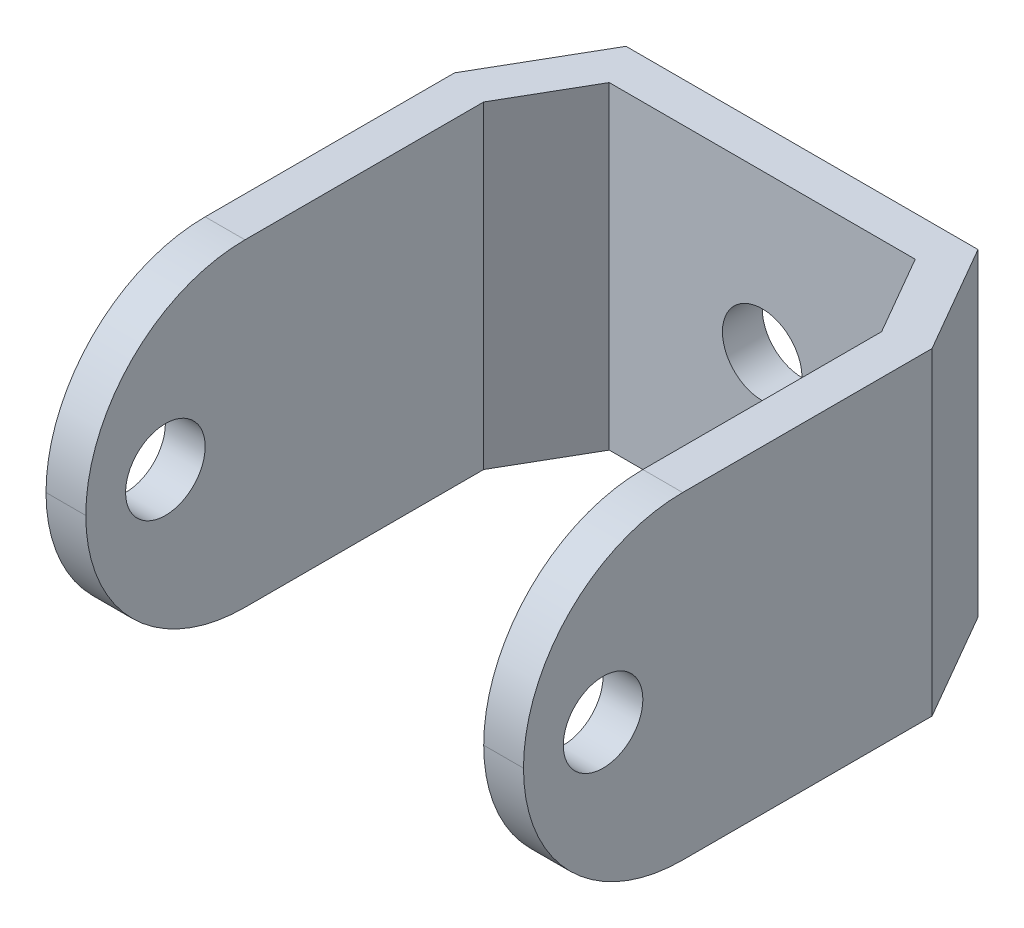
ISO-10303-21;
HEADER;
FILE_DESCRIPTION(('STEP AP214'),'2;1');
FILE_NAME('part.step','',(''),(''),'','','');
FILE_SCHEMA(('AUTOMOTIVE_DESIGN { 1 0 10303 214 1 1 1 1 }'));
ENDSEC;
DATA;
#1=APPLICATION_CONTEXT('core data for automotive mechanical design processes');
#2=APPLICATION_PROTOCOL_DEFINITION('international standard','automotive_design',2000,#1);
#3=PRODUCT_CONTEXT('',#1,'mechanical');
#4=PRODUCT('Part','Part','',(#3));
#5=PRODUCT_RELATED_PRODUCT_CATEGORY('part','',(#4));
#6=PRODUCT_DEFINITION_FORMATION('','',#4);
#7=PRODUCT_DEFINITION_CONTEXT('part definition',#1,'design');
#8=PRODUCT_DEFINITION('design','',#6,#7);
#9=PRODUCT_DEFINITION_SHAPE('','',#8);
#10=(LENGTH_UNIT() NAMED_UNIT(*) SI_UNIT(.MILLI.,.METRE.));
#11=(NAMED_UNIT(*) PLANE_ANGLE_UNIT() SI_UNIT($,.RADIAN.));
#12=(NAMED_UNIT(*) SI_UNIT($,.STERADIAN.) SOLID_ANGLE_UNIT());
#13=UNCERTAINTY_MEASURE_WITH_UNIT(LENGTH_MEASURE(1.E-05),#10,'distance_accuracy_value','');
#14=(GEOMETRIC_REPRESENTATION_CONTEXT(3) GLOBAL_UNCERTAINTY_ASSIGNED_CONTEXT((#13)) GLOBAL_UNIT_ASSIGNED_CONTEXT((#10,
#11,#12)) REPRESENTATION_CONTEXT('',''));
#15=CARTESIAN_POINT('',(0.,0.,0.));
#16=DIRECTION('',(0.,0.,1.));
#17=DIRECTION('',(1.,0.,0.));
#18=AXIS2_PLACEMENT_3D('',#15,#16,#17);
#19=CARTESIAN_POINT('',(-30.,40.,-51.3397459621556));
#20=DIRECTION('',(0.866025403784438,0.,0.500000000000001));
#21=DIRECTION('',(0.500000000000001,0.,-0.866025403784438));
#22=AXIS2_PLACEMENT_3D('',#19,#20,#21);
#23=PLANE('',#22);
#24=DIRECTION('',(-0.500000000000001,0.,0.866025403784438));
#25=VECTOR('',#24,1.);
#26=CARTESIAN_POINT('',(-30.,0.,-51.3397459621556));
#27=LINE('',#26,#25);
#28=CARTESIAN_POINT('',(-22.1132486540519,0.,-65.));
#29=VERTEX_POINT('',#28);
#30=CARTESIAN_POINT('',(-30.,0.,-51.3397459621556));
#31=VERTEX_POINT('',#30);
#32=EDGE_CURVE('E173',#29,#31,#27,.T.);
#33=ORIENTED_EDGE('',*,*,#32,.T.);
#34=DIRECTION('',(0.,-1.,0.));
#35=VECTOR('',#34,1.);
#36=CARTESIAN_POINT('',(-30.,40.,-51.3397459621556));
#37=LINE('',#36,#35);
#38=CARTESIAN_POINT('',(-30.,40.,-51.3397459621556));
#39=VERTEX_POINT('',#38);
#40=EDGE_CURVE('E152',#39,#31,#37,.T.);
#41=ORIENTED_EDGE('',*,*,#40,.F.);
#42=DIRECTION('',(-0.500000000000001,0.,0.866025403784438));
#43=VECTOR('',#42,1.);
#44=CARTESIAN_POINT('',(-30.,40.,-51.3397459621556));
#45=LINE('',#44,#43);
#46=CARTESIAN_POINT('',(-22.1132486540519,40.,-65.));
#47=VERTEX_POINT('',#46);
#48=EDGE_CURVE('E160',#47,#39,#45,.T.);
#49=ORIENTED_EDGE('',*,*,#48,.F.);
#50=DIRECTION('',(0.,-1.,0.));
#51=VECTOR('',#50,1.);
#52=CARTESIAN_POINT('',(-22.1132486540519,40.,-65.));
#53=LINE('',#52,#51);
#54=EDGE_CURVE('E242',#47,#29,#53,.T.);
#55=ORIENTED_EDGE('',*,*,#54,.T.);
#56=EDGE_LOOP('',(#33,#41,#49,#55));
#57=FACE_BOUND('',#56,.T.);
#58=ADVANCED_FACE('F47',(#57),#23,.F.);
#59=CARTESIAN_POINT('',(-30.,40.,0.));
#60=DIRECTION('',(1.,0.,0.));
#61=DIRECTION('',(0.,0.,-1.));
#62=AXIS2_PLACEMENT_3D('',#59,#60,#61);
#63=PLANE('',#62);
#64=CARTESIAN_POINT('',(-30.,20.,-10.));
#65=DIRECTION('',(1.,0.,0.));
#66=DIRECTION('',(0.,0.,-1.));
#67=AXIS2_PLACEMENT_3D('',#64,#65,#66);
#68=CIRCLE('',#67,5.);
#69=CARTESIAN_POINT('',(-30.,20.,-15.));
#70=VERTEX_POINT('',#69);
#71=EDGE_CURVE('E207',#70,#70,#68,.T.);
#72=ORIENTED_EDGE('',*,*,#71,.T.);
#73=EDGE_LOOP('',(#72));
#74=FACE_BOUND('',#73,.T.);
#75=CARTESIAN_POINT('',(-30.,20.,-20.));
#76=DIRECTION('',(1.,0.,0.));
#77=DIRECTION('',(0.,0.,-1.));
#78=AXIS2_PLACEMENT_3D('',#75,#76,#77);
#79=CIRCLE('',#78,20.);
#80=CARTESIAN_POINT('',(-30.,0.,-20.));
#81=VERTEX_POINT('',#80);
#82=CARTESIAN_POINT('',(-30.,20.,0.));
#83=VERTEX_POINT('',#82);
#84=EDGE_CURVE('E64',#81,#83,#79,.F.);
#85=ORIENTED_EDGE('',*,*,#84,.T.);
#86=CARTESIAN_POINT('',(-30.,20.,-20.));
#87=DIRECTION('',(1.,0.,0.));
#88=DIRECTION('',(0.,0.,-1.));
#89=AXIS2_PLACEMENT_3D('',#86,#87,#88);
#90=CIRCLE('',#89,20.);
#91=CARTESIAN_POINT('',(-30.,40.,-20.));
#92=VERTEX_POINT('',#91);
#93=EDGE_CURVE('E155',#83,#92,#90,.F.);
#94=ORIENTED_EDGE('',*,*,#93,.T.);
#95=DIRECTION('',(0.,0.,1.));
#96=VECTOR('',#95,1.);
#97=CARTESIAN_POINT('',(-30.,40.,0.));
#98=LINE('',#97,#96);
#99=EDGE_CURVE('E148',#39,#92,#98,.T.);
#100=ORIENTED_EDGE('',*,*,#99,.F.);
#101=ORIENTED_EDGE('',*,*,#40,.T.);
#102=DIRECTION('',(0.,0.,1.));
#103=VECTOR('',#102,1.);
#104=CARTESIAN_POINT('',(-30.,0.,0.));
#105=LINE('',#104,#103);
#106=EDGE_CURVE('E244',#31,#81,#105,.T.);
#107=ORIENTED_EDGE('',*,*,#106,.T.);
#108=EDGE_LOOP('',(#85,#94,#100,#101,#107));
#109=FACE_BOUND('',#108,.T.);
#110=ADVANCED_FACE('F150',(#74,#109),#63,.F.);
#111=CARTESIAN_POINT('',(-25.,40.,-50.));
#112=DIRECTION('',(-1.,0.,0.));
#113=DIRECTION('',(0.,0.,1.));
#114=AXIS2_PLACEMENT_3D('',#111,#112,#113);
#115=PLANE('',#114);
#116=CARTESIAN_POINT('',(-25.,20.,-10.));
#117=DIRECTION('',(-1.,0.,0.));
#118=DIRECTION('',(0.,0.,1.));
#119=AXIS2_PLACEMENT_3D('',#116,#117,#118);
#120=CIRCLE('',#119,5.);
#121=CARTESIAN_POINT('',(-25.,20.,-5.00000000000001));
#122=VERTEX_POINT('',#121);
#123=EDGE_CURVE('E225',#122,#122,#120,.T.);
#124=ORIENTED_EDGE('',*,*,#123,.T.);
#125=EDGE_LOOP('',(#124));
#126=FACE_BOUND('',#125,.T.);
#127=DIRECTION('',(0.,0.,-1.));
#128=VECTOR('',#127,1.);
#129=CARTESIAN_POINT('',(-25.,40.,-50.));
#130=LINE('',#129,#128);
#131=CARTESIAN_POINT('',(-25.,40.,-20.));
#132=VERTEX_POINT('',#131);
#133=CARTESIAN_POINT('',(-25.,40.,-50.));
#134=VERTEX_POINT('',#133);
#135=EDGE_CURVE('E159',#132,#134,#130,.T.);
#136=ORIENTED_EDGE('',*,*,#135,.F.);
#137=CARTESIAN_POINT('',(-25.,20.,-20.));
#138=DIRECTION('',(-1.,0.,0.));
#139=DIRECTION('',(0.,0.,1.));
#140=AXIS2_PLACEMENT_3D('',#137,#138,#139);
#141=CIRCLE('',#140,20.);
#142=CARTESIAN_POINT('',(-25.,20.,0.));
#143=VERTEX_POINT('',#142);
#144=EDGE_CURVE('E196',#132,#143,#141,.F.);
#145=ORIENTED_EDGE('',*,*,#144,.T.);
#146=CARTESIAN_POINT('',(-25.,20.,-20.));
#147=DIRECTION('',(-1.,0.,0.));
#148=DIRECTION('',(0.,0.,1.));
#149=AXIS2_PLACEMENT_3D('',#146,#147,#148);
#150=CIRCLE('',#149,20.);
#151=CARTESIAN_POINT('',(-25.,0.,-20.));
#152=VERTEX_POINT('',#151);
#153=EDGE_CURVE('E194',#143,#152,#150,.F.);
#154=ORIENTED_EDGE('',*,*,#153,.T.);
#155=DIRECTION('',(0.,0.,-1.));
#156=VECTOR('',#155,1.);
#157=CARTESIAN_POINT('',(-25.,0.,-50.));
#158=LINE('',#157,#156);
#159=CARTESIAN_POINT('',(-25.,0.,-50.));
#160=VERTEX_POINT('',#159);
#161=EDGE_CURVE('E246',#152,#160,#158,.T.);
#162=ORIENTED_EDGE('',*,*,#161,.T.);
#163=DIRECTION('',(0.,-1.,0.));
#164=VECTOR('',#163,1.);
#165=CARTESIAN_POINT('',(-25.,40.,-50.));
#166=LINE('',#165,#164);
#167=EDGE_CURVE('E175',#134,#160,#166,.T.);
#168=ORIENTED_EDGE('',*,*,#167,.F.);
#169=EDGE_LOOP('',(#136,#145,#154,#162,#168));
#170=FACE_BOUND('',#169,.T.);
#171=ADVANCED_FACE('F320',(#126,#170),#115,.F.);
#172=CARTESIAN_POINT('',(-19.2264973081037,40.,-60.));
#173=DIRECTION('',(-0.866025403784438,0.,-0.500000000000001));
#174=DIRECTION('',(-0.500000000000001,0.,0.866025403784438));
#175=AXIS2_PLACEMENT_3D('',#172,#173,#174);
#176=PLANE('',#175);
#177=DIRECTION('',(0.500000000000001,0.,-0.866025403784438));
#178=VECTOR('',#177,1.);
#179=CARTESIAN_POINT('',(-19.2264973081037,0.,-60.));
#180=LINE('',#179,#178);
#181=CARTESIAN_POINT('',(-19.2264973081037,0.,-60.));
#182=VERTEX_POINT('',#181);
#183=EDGE_CURVE('E248',#160,#182,#180,.T.);
#184=ORIENTED_EDGE('',*,*,#183,.T.);
#185=DIRECTION('',(0.,-1.,0.));
#186=VECTOR('',#185,1.);
#187=CARTESIAN_POINT('',(-19.2264973081037,40.,-60.));
#188=LINE('',#187,#186);
#189=CARTESIAN_POINT('',(-19.2264973081037,40.,-60.));
#190=VERTEX_POINT('',#189);
#191=EDGE_CURVE('E180',#190,#182,#188,.T.);
#192=ORIENTED_EDGE('',*,*,#191,.F.);
#193=DIRECTION('',(0.500000000000001,0.,-0.866025403784438));
#194=VECTOR('',#193,1.);
#195=CARTESIAN_POINT('',(-19.2264973081037,40.,-60.));
#196=LINE('',#195,#194);
#197=EDGE_CURVE('E229',#134,#190,#196,.T.);
#198=ORIENTED_EDGE('',*,*,#197,.F.);
#199=ORIENTED_EDGE('',*,*,#167,.T.);
#200=EDGE_LOOP('',(#184,#192,#198,#199));
#201=FACE_BOUND('',#200,.T.);
#202=ADVANCED_FACE('F321',(#201),#176,.F.);
#203=CARTESIAN_POINT('',(19.2264973081037,40.,-60.));
#204=DIRECTION('',(0.,0.,-1.));
#205=DIRECTION('',(-1.,0.,0.));
#206=AXIS2_PLACEMENT_3D('',#203,#204,#205);
#207=PLANE('',#206);
#208=CARTESIAN_POINT('',(0.,20.,-60.));
#209=DIRECTION('',(0.,0.,-1.));
#210=DIRECTION('',(-1.,0.,0.));
#211=AXIS2_PLACEMENT_3D('',#208,#209,#210);
#212=CIRCLE('',#211,5.);
#213=CARTESIAN_POINT('',(-5.,20.,-60.));
#214=VERTEX_POINT('',#213);
#215=EDGE_CURVE('E210',#214,#214,#212,.F.);
#216=ORIENTED_EDGE('',*,*,#215,.F.);
#217=EDGE_LOOP('',(#216));
#218=FACE_BOUND('',#217,.T.);
#219=DIRECTION('',(1.,0.,0.));
#220=VECTOR('',#219,1.);
#221=CARTESIAN_POINT('',(19.2264973081037,0.,-60.));
#222=LINE('',#221,#220);
#223=CARTESIAN_POINT('',(19.2264973081037,0.,-60.));
#224=VERTEX_POINT('',#223);
#225=EDGE_CURVE('E250',#182,#224,#222,.T.);
#226=ORIENTED_EDGE('',*,*,#225,.T.);
#227=DIRECTION('',(0.,-1.,0.));
#228=VECTOR('',#227,1.);
#229=CARTESIAN_POINT('',(19.2264973081037,40.,-60.));
#230=LINE('',#229,#228);
#231=CARTESIAN_POINT('',(19.2264973081037,40.,-60.));
#232=VERTEX_POINT('',#231);
#233=EDGE_CURVE('E272',#232,#224,#230,.T.);
#234=ORIENTED_EDGE('',*,*,#233,.F.);
#235=DIRECTION('',(1.,0.,0.));
#236=VECTOR('',#235,1.);
#237=CARTESIAN_POINT('',(19.2264973081037,40.,-60.));
#238=LINE('',#237,#236);
#239=EDGE_CURVE('E231',#190,#232,#238,.T.);
#240=ORIENTED_EDGE('',*,*,#239,.F.);
#241=ORIENTED_EDGE('',*,*,#191,.T.);
#242=EDGE_LOOP('',(#226,#234,#240,#241));
#243=FACE_BOUND('',#242,.T.);
#244=ADVANCED_FACE('F279',(#218,#243),#207,.F.);
#245=CARTESIAN_POINT('',(25.,40.,-50.));
#246=DIRECTION('',(0.866025403784438,0.,-0.500000000000001));
#247=DIRECTION('',(-0.500000000000001,0.,-0.866025403784438));
#248=AXIS2_PLACEMENT_3D('',#245,#246,#247);
#249=PLANE('',#248);
#250=DIRECTION('',(0.500000000000001,0.,0.866025403784438));
#251=VECTOR('',#250,1.);
#252=CARTESIAN_POINT('',(25.,0.,-50.));
#253=LINE('',#252,#251);
#254=CARTESIAN_POINT('',(25.,0.,-50.));
#255=VERTEX_POINT('',#254);
#256=EDGE_CURVE('E252',#224,#255,#253,.T.);
#257=ORIENTED_EDGE('',*,*,#256,.T.);
#258=DIRECTION('',(0.,-1.,0.));
#259=VECTOR('',#258,1.);
#260=CARTESIAN_POINT('',(25.,40.,-50.));
#261=LINE('',#260,#259);
#262=CARTESIAN_POINT('',(25.,40.,-50.));
#263=VERTEX_POINT('',#262);
#264=EDGE_CURVE('E269',#263,#255,#261,.T.);
#265=ORIENTED_EDGE('',*,*,#264,.F.);
#266=DIRECTION('',(0.500000000000001,0.,0.866025403784438));
#267=VECTOR('',#266,1.);
#268=CARTESIAN_POINT('',(25.,40.,-50.));
#269=LINE('',#268,#267);
#270=EDGE_CURVE('E233',#232,#263,#269,.T.);
#271=ORIENTED_EDGE('',*,*,#270,.F.);
#272=ORIENTED_EDGE('',*,*,#233,.T.);
#273=EDGE_LOOP('',(#257,#265,#271,#272));
#274=FACE_BOUND('',#273,.T.);
#275=ADVANCED_FACE('F289',(#274),#249,.F.);
#276=CARTESIAN_POINT('',(25.,40.,0.));
#277=DIRECTION('',(1.,0.,0.));
#278=DIRECTION('',(0.,0.,-1.));
#279=AXIS2_PLACEMENT_3D('',#276,#277,#278);
#280=PLANE('',#279);
#281=CARTESIAN_POINT('',(25.,20.,-10.));
#282=DIRECTION('',(1.,0.,0.));
#283=DIRECTION('',(0.,0.,-1.));
#284=AXIS2_PLACEMENT_3D('',#281,#282,#283);
#285=CIRCLE('',#284,5.);
#286=CARTESIAN_POINT('',(25.,20.,-15.));
#287=VERTEX_POINT('',#286);
#288=EDGE_CURVE('E221',#287,#287,#285,.T.);
#289=ORIENTED_EDGE('',*,*,#288,.T.);
#290=EDGE_LOOP('',(#289));
#291=FACE_BOUND('',#290,.T.);
#292=CARTESIAN_POINT('',(25.,20.,-20.));
#293=DIRECTION('',(1.,0.,0.));
#294=DIRECTION('',(0.,0.,-1.));
#295=AXIS2_PLACEMENT_3D('',#292,#293,#294);
#296=CIRCLE('',#295,20.);
#297=CARTESIAN_POINT('',(25.,0.,-20.));
#298=VERTEX_POINT('',#297);
#299=CARTESIAN_POINT('',(25.,20.,0.));
#300=VERTEX_POINT('',#299);
#301=EDGE_CURVE('E190',#298,#300,#296,.F.);
#302=ORIENTED_EDGE('',*,*,#301,.T.);
#303=CARTESIAN_POINT('',(25.,20.,-20.));
#304=DIRECTION('',(1.,0.,0.));
#305=DIRECTION('',(0.,0.,-1.));
#306=AXIS2_PLACEMENT_3D('',#303,#304,#305);
#307=CIRCLE('',#306,20.);
#308=CARTESIAN_POINT('',(25.,40.,-20.));
#309=VERTEX_POINT('',#308);
#310=EDGE_CURVE('E192',#300,#309,#307,.F.);
#311=ORIENTED_EDGE('',*,*,#310,.T.);
#312=DIRECTION('',(0.,0.,1.));
#313=VECTOR('',#312,1.);
#314=CARTESIAN_POINT('',(25.,40.,0.));
#315=LINE('',#314,#313);
#316=EDGE_CURVE('E235',#263,#309,#315,.T.);
#317=ORIENTED_EDGE('',*,*,#316,.F.);
#318=ORIENTED_EDGE('',*,*,#264,.T.);
#319=DIRECTION('',(0.,0.,1.));
#320=VECTOR('',#319,1.);
#321=CARTESIAN_POINT('',(25.,0.,0.));
#322=LINE('',#321,#320);
#323=EDGE_CURVE('E254',#255,#298,#322,.T.);
#324=ORIENTED_EDGE('',*,*,#323,.T.);
#325=EDGE_LOOP('',(#302,#311,#317,#318,#324));
#326=FACE_BOUND('',#325,.T.);
#327=ADVANCED_FACE('F293',(#291,#326),#280,.F.);
#328=CARTESIAN_POINT('',(30.,40.,-51.3397459621556));
#329=DIRECTION('',(-1.,0.,0.));
#330=DIRECTION('',(0.,0.,1.));
#331=AXIS2_PLACEMENT_3D('',#328,#329,#330);
#332=PLANE('',#331);
#333=CARTESIAN_POINT('',(30.,20.,-10.));
#334=DIRECTION('',(1.,0.,0.));
#335=DIRECTION('',(0.,0.,-1.));
#336=AXIS2_PLACEMENT_3D('',#333,#334,#335);
#337=CIRCLE('',#336,5.);
#338=CARTESIAN_POINT('',(30.,20.,-15.));
#339=VERTEX_POINT('',#338);
#340=EDGE_CURVE('E202',#339,#339,#337,.T.);
#341=ORIENTED_EDGE('',*,*,#340,.F.);
#342=EDGE_LOOP('',(#341));
#343=FACE_BOUND('',#342,.T.);
#344=DIRECTION('',(0.,0.,-1.));
#345=VECTOR('',#344,1.);
#346=CARTESIAN_POINT('',(30.,40.,-51.3397459621556));
#347=LINE('',#346,#345);
#348=CARTESIAN_POINT('',(30.,40.,-20.));
#349=VERTEX_POINT('',#348);
#350=CARTESIAN_POINT('',(30.,40.,-51.3397459621556));
#351=VERTEX_POINT('',#350);
#352=EDGE_CURVE('E237',#349,#351,#347,.T.);
#353=ORIENTED_EDGE('',*,*,#352,.F.);
#354=CARTESIAN_POINT('',(30.,20.,-20.));
#355=DIRECTION('',(-1.,0.,0.));
#356=DIRECTION('',(0.,0.,1.));
#357=AXIS2_PLACEMENT_3D('',#354,#355,#356);
#358=CIRCLE('',#357,20.);
#359=CARTESIAN_POINT('',(30.,20.,0.));
#360=VERTEX_POINT('',#359);
#361=EDGE_CURVE('E188',#349,#360,#358,.F.);
#362=ORIENTED_EDGE('',*,*,#361,.T.);
#363=CARTESIAN_POINT('',(30.,20.,-20.));
#364=DIRECTION('',(-1.,0.,0.));
#365=DIRECTION('',(0.,0.,1.));
#366=AXIS2_PLACEMENT_3D('',#363,#364,#365);
#367=CIRCLE('',#366,20.);
#368=CARTESIAN_POINT('',(30.,0.,-20.));
#369=VERTEX_POINT('',#368);
#370=EDGE_CURVE('E186',#360,#369,#367,.F.);
#371=ORIENTED_EDGE('',*,*,#370,.T.);
#372=DIRECTION('',(0.,0.,-1.));
#373=VECTOR('',#372,1.);
#374=CARTESIAN_POINT('',(30.,0.,-51.3397459621556));
#375=LINE('',#374,#373);
#376=CARTESIAN_POINT('',(30.,0.,-51.3397459621556));
#377=VERTEX_POINT('',#376);
#378=EDGE_CURVE('E257',#369,#377,#375,.T.);
#379=ORIENTED_EDGE('',*,*,#378,.T.);
#380=DIRECTION('',(0.,-1.,0.));
#381=VECTOR('',#380,1.);
#382=CARTESIAN_POINT('',(30.,40.,-51.3397459621556));
#383=LINE('',#382,#381);
#384=EDGE_CURVE('E266',#351,#377,#383,.T.);
#385=ORIENTED_EDGE('',*,*,#384,.F.);
#386=EDGE_LOOP('',(#353,#362,#371,#379,#385));
#387=FACE_BOUND('',#386,.T.);
#388=ADVANCED_FACE('F300',(#343,#387),#332,.F.);
#389=CARTESIAN_POINT('',(22.1132486540519,40.,-65.));
#390=DIRECTION('',(-0.866025403784438,0.,0.500000000000001));
#391=DIRECTION('',(0.500000000000001,0.,0.866025403784438));
#392=AXIS2_PLACEMENT_3D('',#389,#390,#391);
#393=PLANE('',#392);
#394=DIRECTION('',(-0.500000000000001,0.,-0.866025403784438));
#395=VECTOR('',#394,1.);
#396=CARTESIAN_POINT('',(22.1132486540519,0.,-65.));
#397=LINE('',#396,#395);
#398=CARTESIAN_POINT('',(22.1132486540519,0.,-65.));
#399=VERTEX_POINT('',#398);
#400=EDGE_CURVE('E259',#377,#399,#397,.T.);
#401=ORIENTED_EDGE('',*,*,#400,.T.);
#402=DIRECTION('',(0.,-1.,0.));
#403=VECTOR('',#402,1.);
#404=CARTESIAN_POINT('',(22.1132486540519,40.,-65.));
#405=LINE('',#404,#403);
#406=CARTESIAN_POINT('',(22.1132486540519,40.,-65.));
#407=VERTEX_POINT('',#406);
#408=EDGE_CURVE('E263',#407,#399,#405,.T.);
#409=ORIENTED_EDGE('',*,*,#408,.F.);
#410=DIRECTION('',(-0.500000000000001,0.,-0.866025403784438));
#411=VECTOR('',#410,1.);
#412=CARTESIAN_POINT('',(22.1132486540519,40.,-65.));
#413=LINE('',#412,#411);
#414=EDGE_CURVE('E239',#351,#407,#413,.T.);
#415=ORIENTED_EDGE('',*,*,#414,.F.);
#416=ORIENTED_EDGE('',*,*,#384,.T.);
#417=EDGE_LOOP('',(#401,#409,#415,#416));
#418=FACE_BOUND('',#417,.T.);
#419=ADVANCED_FACE('F310',(#418),#393,.F.);
#420=CARTESIAN_POINT('',(-22.1132486540519,40.,-65.));
#421=DIRECTION('',(0.,0.,1.));
#422=DIRECTION('',(1.,0.,0.));
#423=AXIS2_PLACEMENT_3D('',#420,#421,#422);
#424=PLANE('',#423);
#425=CARTESIAN_POINT('',(0.,20.,-65.));
#426=DIRECTION('',(0.,0.,-1.));
#427=DIRECTION('',(-1.,0.,0.));
#428=AXIS2_PLACEMENT_3D('',#425,#426,#427);
#429=CIRCLE('',#428,5.);
#430=CARTESIAN_POINT('',(-5.,20.,-65.));
#431=VERTEX_POINT('',#430);
#432=EDGE_CURVE('E213',#431,#431,#429,.T.);
#433=ORIENTED_EDGE('',*,*,#432,.F.);
#434=EDGE_LOOP('',(#433));
#435=FACE_BOUND('',#434,.T.);
#436=DIRECTION('',(-1.,0.,0.));
#437=VECTOR('',#436,1.);
#438=CARTESIAN_POINT('',(-22.1132486540519,0.,-65.));
#439=LINE('',#438,#437);
#440=EDGE_CURVE('E170',#399,#29,#439,.T.);
#441=ORIENTED_EDGE('',*,*,#440,.T.);
#442=ORIENTED_EDGE('',*,*,#54,.F.);
#443=DIRECTION('',(-1.,0.,0.));
#444=VECTOR('',#443,1.);
#445=CARTESIAN_POINT('',(-22.1132486540519,40.,-65.));
#446=LINE('',#445,#444);
#447=EDGE_CURVE('E166',#407,#47,#446,.T.);
#448=ORIENTED_EDGE('',*,*,#447,.F.);
#449=ORIENTED_EDGE('',*,*,#408,.T.);
#450=EDGE_LOOP('',(#441,#442,#448,#449));
#451=FACE_BOUND('',#450,.T.);
#452=ADVANCED_FACE('F313',(#435,#451),#424,.F.);
#453=CARTESIAN_POINT('',(0.,40.,0.));
#454=DIRECTION('',(0.,-1.,0.));
#455=DIRECTION('',(0.,0.,-1.));
#456=AXIS2_PLACEMENT_3D('',#453,#454,#455);
#457=PLANE('',#456);
#458=ORIENTED_EDGE('',*,*,#316,.T.);
#459=DIRECTION('',(1.,0.,0.));
#460=VECTOR('',#459,1.);
#461=CARTESIAN_POINT('',(0.,40.,-20.));
#462=LINE('',#461,#460);
#463=EDGE_CURVE('E177',#309,#349,#462,.T.);
#464=ORIENTED_EDGE('',*,*,#463,.T.);
#465=ORIENTED_EDGE('',*,*,#352,.T.);
#466=ORIENTED_EDGE('',*,*,#414,.T.);
#467=ORIENTED_EDGE('',*,*,#447,.T.);
#468=ORIENTED_EDGE('',*,*,#48,.T.);
#469=ORIENTED_EDGE('',*,*,#99,.T.);
#470=DIRECTION('',(1.,0.,0.));
#471=VECTOR('',#470,1.);
#472=CARTESIAN_POINT('',(0.,40.,-20.));
#473=LINE('',#472,#471);
#474=EDGE_CURVE('E174',#92,#132,#473,.T.);
#475=ORIENTED_EDGE('',*,*,#474,.T.);
#476=ORIENTED_EDGE('',*,*,#135,.T.);
#477=ORIENTED_EDGE('',*,*,#197,.T.);
#478=ORIENTED_EDGE('',*,*,#239,.T.);
#479=ORIENTED_EDGE('',*,*,#270,.T.);
#480=EDGE_LOOP('',(#458,#464,#465,#466,#467,#468,#469,#475,#476,#477,#478,#479));
#481=FACE_BOUND('',#480,.T.);
#482=ADVANCED_FACE('F164',(#481),#457,.F.);
#483=CARTESIAN_POINT('',(0.,0.,0.));
#484=DIRECTION('',(0.,-1.,0.));
#485=DIRECTION('',(0.,0.,-1.));
#486=AXIS2_PLACEMENT_3D('',#483,#484,#485);
#487=PLANE('',#486);
#488=ORIENTED_EDGE('',*,*,#161,.F.);
#489=DIRECTION('',(1.,0.,0.));
#490=VECTOR('',#489,1.);
#491=CARTESIAN_POINT('',(-30.,0.,-20.));
#492=LINE('',#491,#490);
#493=EDGE_CURVE('E11',#152,#81,#492,.F.);
#494=ORIENTED_EDGE('',*,*,#493,.T.);
#495=ORIENTED_EDGE('',*,*,#106,.F.);
#496=ORIENTED_EDGE('',*,*,#32,.F.);
#497=ORIENTED_EDGE('',*,*,#440,.F.);
#498=ORIENTED_EDGE('',*,*,#400,.F.);
#499=ORIENTED_EDGE('',*,*,#378,.F.);
#500=DIRECTION('',(1.,0.,0.));
#501=VECTOR('',#500,1.);
#502=CARTESIAN_POINT('',(25.,0.,-20.));
#503=LINE('',#502,#501);
#504=EDGE_CURVE('E56',#369,#298,#503,.F.);
#505=ORIENTED_EDGE('',*,*,#504,.T.);
#506=ORIENTED_EDGE('',*,*,#323,.F.);
#507=ORIENTED_EDGE('',*,*,#256,.F.);
#508=ORIENTED_EDGE('',*,*,#225,.F.);
#509=ORIENTED_EDGE('',*,*,#183,.F.);
#510=EDGE_LOOP('',(#488,#494,#495,#496,#497,#498,#499,#505,#506,#507,#508,#509));
#511=FACE_BOUND('',#510,.T.);
#512=ADVANCED_FACE('F285',(#511),#487,.T.);
#513=CARTESIAN_POINT('',(-30.,20.,-10.));
#514=DIRECTION('',(1.,0.,0.));
#515=DIRECTION('',(0.,0.,-1.));
#516=AXIS2_PLACEMENT_3D('',#513,#514,#515);
#517=CYLINDRICAL_SURFACE('',#516,5.);
#518=ORIENTED_EDGE('',*,*,#340,.T.);
#519=EDGE_LOOP('',(#518));
#520=FACE_BOUND('',#519,.T.);
#521=ORIENTED_EDGE('',*,*,#288,.F.);
#522=EDGE_LOOP('',(#521));
#523=FACE_BOUND('',#522,.T.);
#524=ADVANCED_FACE('F369',(#520,#523),#517,.F.);
#525=ORIENTED_EDGE('',*,*,#71,.F.);
#526=EDGE_LOOP('',(#525));
#527=FACE_BOUND('',#526,.T.);
#528=ORIENTED_EDGE('',*,*,#123,.F.);
#529=EDGE_LOOP('',(#528));
#530=FACE_BOUND('',#529,.T.);
#531=ADVANCED_FACE('F343',(#527,#530),#517,.F.);
#532=CARTESIAN_POINT('',(30.,20.,-20.));
#533=DIRECTION('',(-1.,0.,0.));
#534=DIRECTION('',(0.,0.,1.));
#535=AXIS2_PLACEMENT_3D('',#532,#533,#534);
#536=CYLINDRICAL_SURFACE('',#535,20.);
#537=DIRECTION('',(1.,0.,0.));
#538=VECTOR('',#537,1.);
#539=CARTESIAN_POINT('',(30.,20.,0.));
#540=LINE('',#539,#538);
#541=EDGE_CURVE('E200',#300,#360,#540,.T.);
#542=ORIENTED_EDGE('',*,*,#541,.F.);
#543=ORIENTED_EDGE('',*,*,#301,.F.);
#544=ORIENTED_EDGE('',*,*,#504,.F.);
#545=ORIENTED_EDGE('',*,*,#370,.F.);
#546=EDGE_LOOP('',(#542,#543,#544,#545));
#547=FACE_BOUND('',#546,.T.);
#548=ADVANCED_FACE('F305',(#547),#536,.T.);
#549=CARTESIAN_POINT('',(0.,20.,-20.));
#550=DIRECTION('',(1.,0.,0.));
#551=DIRECTION('',(0.,0.,-1.));
#552=AXIS2_PLACEMENT_3D('',#549,#550,#551);
#553=CYLINDRICAL_SURFACE('',#552,20.);
#554=ORIENTED_EDGE('',*,*,#310,.F.);
#555=ORIENTED_EDGE('',*,*,#541,.T.);
#556=ORIENTED_EDGE('',*,*,#361,.F.);
#557=ORIENTED_EDGE('',*,*,#463,.F.);
#558=EDGE_LOOP('',(#554,#555,#556,#557));
#559=FACE_BOUND('',#558,.T.);
#560=ADVANCED_FACE('F297',(#559),#553,.T.);
#561=CARTESIAN_POINT('',(-25.,20.,-20.));
#562=DIRECTION('',(-1.,0.,0.));
#563=DIRECTION('',(0.,0.,1.));
#564=AXIS2_PLACEMENT_3D('',#561,#562,#563);
#565=CYLINDRICAL_SURFACE('',#564,20.);
#566=DIRECTION('',(1.,0.,0.));
#567=VECTOR('',#566,1.);
#568=CARTESIAN_POINT('',(-25.,20.,0.));
#569=LINE('',#568,#567);
#570=EDGE_CURVE('E51',#83,#143,#569,.T.);
#571=ORIENTED_EDGE('',*,*,#570,.F.);
#572=ORIENTED_EDGE('',*,*,#84,.F.);
#573=ORIENTED_EDGE('',*,*,#493,.F.);
#574=ORIENTED_EDGE('',*,*,#153,.F.);
#575=EDGE_LOOP('',(#571,#572,#573,#574));
#576=FACE_BOUND('',#575,.T.);
#577=ADVANCED_FACE('F49',(#576),#565,.T.);
#578=CARTESIAN_POINT('',(0.,20.,-20.));
#579=DIRECTION('',(1.,0.,0.));
#580=DIRECTION('',(0.,0.,-1.));
#581=AXIS2_PLACEMENT_3D('',#578,#579,#580);
#582=CYLINDRICAL_SURFACE('',#581,20.);
#583=ORIENTED_EDGE('',*,*,#93,.F.);
#584=ORIENTED_EDGE('',*,*,#570,.T.);
#585=ORIENTED_EDGE('',*,*,#144,.F.);
#586=ORIENTED_EDGE('',*,*,#474,.F.);
#587=EDGE_LOOP('',(#583,#584,#585,#586));
#588=FACE_BOUND('',#587,.T.);
#589=ADVANCED_FACE('F316',(#588),#582,.T.);
#590=CARTESIAN_POINT('',(0.,20.,0.001000000000001));
#591=DIRECTION('',(0.,0.,-1.));
#592=DIRECTION('',(-1.,0.,0.));
#593=AXIS2_PLACEMENT_3D('',#590,#591,#592);
#594=CYLINDRICAL_SURFACE('',#593,5.);
#595=ORIENTED_EDGE('',*,*,#432,.T.);
#596=EDGE_LOOP('',(#595));
#597=FACE_BOUND('',#596,.T.);
#598=ORIENTED_EDGE('',*,*,#215,.T.);
#599=EDGE_LOOP('',(#598));
#600=FACE_BOUND('',#599,.T.);
#601=ADVANCED_FACE('F345',(#597,#600),#594,.F.);
#602=CLOSED_SHELL('',(#58,#110,#171,#202,#244,#275,#327,#388,#419,#452,#482,#512,#524,#531,#548,
#560,#577,#589,#601));
#603=MANIFOLD_SOLID_BREP('B2',#602);
#604=ADVANCED_BREP_SHAPE_REPRESENTATION('',(#18,#603),#14);
#605=SHAPE_DEFINITION_REPRESENTATION(#9,#604);
ENDSEC;
END-ISO-10303-21;
